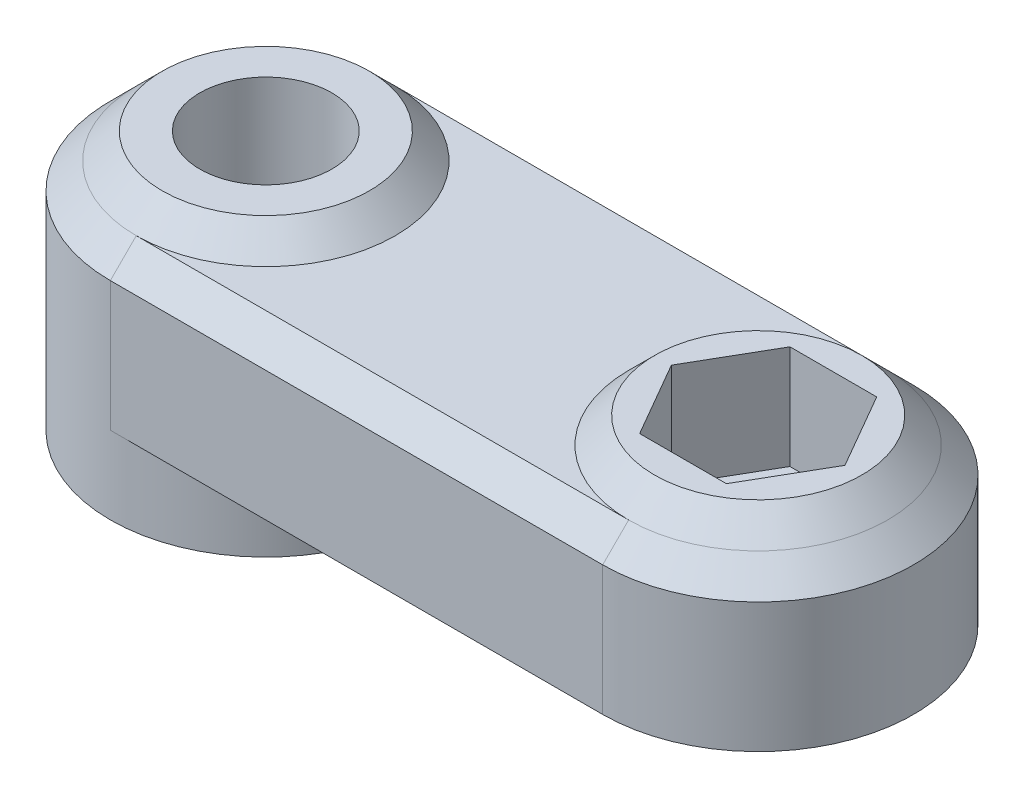
ISO-10303-21;
HEADER;
FILE_DESCRIPTION(('STEP AP214'),'2;1');
FILE_NAME('part.step','',(''),(''),'','','');
FILE_SCHEMA(('AUTOMOTIVE_DESIGN { 1 0 10303 214 1 1 1 1 }'));
ENDSEC;
DATA;
#1=APPLICATION_CONTEXT('core data for automotive mechanical design processes');
#2=APPLICATION_PROTOCOL_DEFINITION('international standard','automotive_design',2000,#1);
#3=PRODUCT_CONTEXT('',#1,'mechanical');
#4=PRODUCT('Part','Part','',(#3));
#5=PRODUCT_RELATED_PRODUCT_CATEGORY('part','',(#4));
#6=PRODUCT_DEFINITION_FORMATION('','',#4);
#7=PRODUCT_DEFINITION_CONTEXT('part definition',#1,'design');
#8=PRODUCT_DEFINITION('design','',#6,#7);
#9=PRODUCT_DEFINITION_SHAPE('','',#8);
#10=(LENGTH_UNIT() NAMED_UNIT(*) SI_UNIT(.MILLI.,.METRE.));
#11=(NAMED_UNIT(*) PLANE_ANGLE_UNIT() SI_UNIT($,.RADIAN.));
#12=(NAMED_UNIT(*) SI_UNIT($,.STERADIAN.) SOLID_ANGLE_UNIT());
#13=UNCERTAINTY_MEASURE_WITH_UNIT(LENGTH_MEASURE(1.E-05),#10,'distance_accuracy_value','');
#14=(GEOMETRIC_REPRESENTATION_CONTEXT(3) GLOBAL_UNCERTAINTY_ASSIGNED_CONTEXT((#13)) GLOBAL_UNIT_ASSIGNED_CONTEXT((#10,
#11,#12)) REPRESENTATION_CONTEXT('',''));
#15=CARTESIAN_POINT('',(0.,0.,0.));
#16=DIRECTION('',(0.,0.,1.));
#17=DIRECTION('',(1.,0.,0.));
#18=AXIS2_PLACEMENT_3D('',#15,#16,#17);
#19=CARTESIAN_POINT('',(0.,10.,0.));
#20=DIRECTION('',(0.,1.,0.));
#21=DIRECTION('',(0.,0.,1.));
#22=AXIS2_PLACEMENT_3D('',#19,#20,#21);
#23=PLANE('',#22);
#24=CARTESIAN_POINT('',(0.,10.,0.));
#25=DIRECTION('',(0.,-1.,0.));
#26=DIRECTION('',(0.,0.,-1.));
#27=AXIS2_PLACEMENT_3D('',#24,#25,#26);
#28=CIRCLE('',#27,2.55);
#29=CARTESIAN_POINT('',(0.,10.,-2.55));
#30=VERTEX_POINT('',#29);
#31=EDGE_CURVE('E276',#30,#30,#28,.T.);
#32=ORIENTED_EDGE('',*,*,#31,.T.);
#33=EDGE_LOOP('',(#32));
#34=FACE_BOUND('',#33,.T.);
#35=CARTESIAN_POINT('',(0.,10.,0.));
#36=DIRECTION('',(0.,1.,0.));
#37=DIRECTION('',(0.,0.,1.));
#38=AXIS2_PLACEMENT_3D('',#35,#36,#37);
#39=CIRCLE('',#38,4.);
#40=CARTESIAN_POINT('',(0.,10.,4.));
#41=VERTEX_POINT('',#40);
#42=EDGE_CURVE('E295',#41,#41,#39,.T.);
#43=ORIENTED_EDGE('',*,*,#42,.T.);
#44=EDGE_LOOP('',(#43));
#45=FACE_BOUND('',#44,.T.);
#46=ADVANCED_FACE('F37',(#34,#45),#23,.T.);
#47=DIRECTION('',(-0.5,0.,-0.866025403784439));
#48=VECTOR('',#47,1.);
#49=CARTESIAN_POINT('',(22.3486315612998,10.,0.));
#50=LINE('',#49,#48);
#51=CARTESIAN_POINT('',(22.3486315612998,10.,0.));
#52=VERTEX_POINT('',#51);
#53=CARTESIAN_POINT('',(20.6743157806499,10.,-2.9));
#54=VERTEX_POINT('',#53);
#55=EDGE_CURVE('E59',#52,#54,#50,.T.);
#56=ORIENTED_EDGE('',*,*,#55,.F.);
#57=DIRECTION('',(0.5,0.,-0.866025403784438));
#58=VECTOR('',#57,1.);
#59=CARTESIAN_POINT('',(20.6743157806499,10.,2.90000000000001));
#60=LINE('',#59,#58);
#61=CARTESIAN_POINT('',(20.6743157806499,10.,2.90000000000001));
#62=VERTEX_POINT('',#61);
#63=EDGE_CURVE('E325',#62,#52,#60,.T.);
#64=ORIENTED_EDGE('',*,*,#63,.F.);
#65=DIRECTION('',(1.,0.,0.));
#66=VECTOR('',#65,1.);
#67=CARTESIAN_POINT('',(17.3256842193501,10.,2.90000000000001));
#68=LINE('',#67,#66);
#69=CARTESIAN_POINT('',(17.3256842193501,10.,2.90000000000001));
#70=VERTEX_POINT('',#69);
#71=EDGE_CURVE('E348',#70,#62,#68,.T.);
#72=ORIENTED_EDGE('',*,*,#71,.F.);
#73=DIRECTION('',(0.5,0.,0.866025403784438));
#74=VECTOR('',#73,1.);
#75=CARTESIAN_POINT('',(15.6513684387002,10.,0.));
#76=LINE('',#75,#74);
#77=CARTESIAN_POINT('',(15.6513684387002,10.,0.));
#78=VERTEX_POINT('',#77);
#79=EDGE_CURVE('E345',#78,#70,#76,.T.);
#80=ORIENTED_EDGE('',*,*,#79,.F.);
#81=DIRECTION('',(-0.500000000000001,0.,0.866025403784438));
#82=VECTOR('',#81,1.);
#83=CARTESIAN_POINT('',(17.3256842193501,10.,-2.9));
#84=LINE('',#83,#82);
#85=CARTESIAN_POINT('',(17.3256842193501,10.,-2.9));
#86=VERTEX_POINT('',#85);
#87=EDGE_CURVE('E342',#86,#78,#84,.T.);
#88=ORIENTED_EDGE('',*,*,#87,.F.);
#89=DIRECTION('',(-1.,0.,0.));
#90=VECTOR('',#89,1.);
#91=CARTESIAN_POINT('',(20.6743157806499,10.,-2.9));
#92=LINE('',#91,#90);
#93=EDGE_CURVE('E317',#54,#86,#92,.T.);
#94=ORIENTED_EDGE('',*,*,#93,.F.);
#95=EDGE_LOOP('',(#56,#64,#72,#80,#88,#94));
#96=FACE_BOUND('',#95,.T.);
#97=CARTESIAN_POINT('',(19.,10.,0.));
#98=DIRECTION('',(0.,1.,0.));
#99=DIRECTION('',(0.,0.,1.));
#100=AXIS2_PLACEMENT_3D('',#97,#98,#99);
#101=CIRCLE('',#100,3.99999999999999);
#102=CARTESIAN_POINT('',(19.,10.,3.99999999999999));
#103=VERTEX_POINT('',#102);
#104=EDGE_CURVE('E292',#103,#103,#101,.T.);
#105=ORIENTED_EDGE('',*,*,#104,.T.);
#106=EDGE_LOOP('',(#105));
#107=FACE_BOUND('',#106,.T.);
#108=ADVANCED_FACE('F367',(#96,#107),#23,.T.);
#109=CARTESIAN_POINT('',(0.,10.,4.));
#110=DIRECTION('',(0.,0.707106781186546,0.707106781186549));
#111=DIRECTION('',(-1.,0.,0.));
#112=AXIS2_PLACEMENT_3D('',#109,#110,#111);
#113=PLANE('',#112);
#114=DIRECTION('',(0.,-0.707106781186549,0.707106781186546));
#115=VECTOR('',#114,1.);
#116=CARTESIAN_POINT('',(19.,10.,3.99999999999999));
#117=LINE('',#116,#115);
#118=CARTESIAN_POINT('',(19.,9.,4.99999999999999));
#119=VERTEX_POINT('',#118);
#120=CARTESIAN_POINT('',(19.,7.99999999999999,6.));
#121=VERTEX_POINT('',#120);
#122=EDGE_CURVE('E200',#119,#121,#117,.T.);
#123=ORIENTED_EDGE('',*,*,#122,.F.);
#124=DIRECTION('',(-1.,0.,0.));
#125=VECTOR('',#124,1.);
#126=CARTESIAN_POINT('',(0.,9.,4.99999999999999));
#127=LINE('',#126,#125);
#128=CARTESIAN_POINT('',(0.,9.,4.99999999999999));
#129=VERTEX_POINT('',#128);
#130=EDGE_CURVE('E315',#119,#129,#127,.T.);
#131=ORIENTED_EDGE('',*,*,#130,.T.);
#132=DIRECTION('',(0.,0.707106781186549,-0.707106781186546));
#133=VECTOR('',#132,1.);
#134=CARTESIAN_POINT('',(0.,7.99999999999999,6.));
#135=LINE('',#134,#133);
#136=CARTESIAN_POINT('',(0.,7.99999999999999,6.));
#137=VERTEX_POINT('',#136);
#138=EDGE_CURVE('E183',#137,#129,#135,.T.);
#139=ORIENTED_EDGE('',*,*,#138,.F.);
#140=DIRECTION('',(-1.,0.,0.));
#141=VECTOR('',#140,1.);
#142=CARTESIAN_POINT('',(0.,7.99999999999999,6.));
#143=LINE('',#142,#141);
#144=EDGE_CURVE('E174',#121,#137,#143,.T.);
#145=ORIENTED_EDGE('',*,*,#144,.F.);
#146=EDGE_LOOP('',(#123,#131,#139,#145));
#147=FACE_BOUND('',#146,.T.);
#148=ADVANCED_FACE('F314',(#147),#113,.T.);
#149=CARTESIAN_POINT('',(19.,10.,0.));
#150=DIRECTION('',(0.,-1.,0.));
#151=DIRECTION('',(0.,0.,-1.));
#152=AXIS2_PLACEMENT_3D('',#149,#150,#151);
#153=CONICAL_SURFACE('',#152,3.99999999999999,0.785398163397447);
#154=DIRECTION('',(0.,-0.707106781186549,-0.707106781186546));
#155=VECTOR('',#154,1.);
#156=CARTESIAN_POINT('',(19.,10.,-3.99999999999999));
#157=LINE('',#156,#155);
#158=CARTESIAN_POINT('',(19.,9.,-4.99999999999999));
#159=VERTEX_POINT('',#158);
#160=CARTESIAN_POINT('',(19.,7.99999999999999,-6.));
#161=VERTEX_POINT('',#160);
#162=EDGE_CURVE('E189',#159,#161,#157,.T.);
#163=ORIENTED_EDGE('',*,*,#162,.F.);
#164=CARTESIAN_POINT('',(19.,9.,0.));
#165=DIRECTION('',(0.,1.,0.));
#166=DIRECTION('',(0.,0.,1.));
#167=AXIS2_PLACEMENT_3D('',#164,#165,#166);
#168=CIRCLE('',#167,4.99999999999999);
#169=EDGE_CURVE('E52',#159,#119,#168,.F.);
#170=ORIENTED_EDGE('',*,*,#169,.T.);
#171=ORIENTED_EDGE('',*,*,#122,.T.);
#172=CARTESIAN_POINT('',(19.,7.99999999999999,0.));
#173=DIRECTION('',(0.,1.,0.));
#174=DIRECTION('',(0.,0.,1.));
#175=AXIS2_PLACEMENT_3D('',#172,#173,#174);
#176=CIRCLE('',#175,6.);
#177=EDGE_CURVE('E300',#161,#121,#176,.F.);
#178=ORIENTED_EDGE('',*,*,#177,.F.);
#179=EDGE_LOOP('',(#163,#170,#171,#178));
#180=FACE_BOUND('',#179,.T.);
#181=ADVANCED_FACE('F434',(#180),#153,.T.);
#182=CARTESIAN_POINT('',(0.,10.,0.));
#183=DIRECTION('',(0.,-1.,0.));
#184=DIRECTION('',(0.,0.,-1.));
#185=AXIS2_PLACEMENT_3D('',#182,#183,#184);
#186=CONICAL_SURFACE('',#185,4.,0.785398163397447);
#187=ORIENTED_EDGE('',*,*,#138,.T.);
#188=CARTESIAN_POINT('',(0.,9.,0.));
#189=DIRECTION('',(0.,1.,0.));
#190=DIRECTION('',(0.,0.,1.));
#191=AXIS2_PLACEMENT_3D('',#188,#189,#190);
#192=CIRCLE('',#191,4.99999999999999);
#193=CARTESIAN_POINT('',(0.,9.,-4.99999999999999));
#194=VERTEX_POINT('',#193);
#195=EDGE_CURVE('E165',#129,#194,#192,.F.);
#196=ORIENTED_EDGE('',*,*,#195,.T.);
#197=DIRECTION('',(0.,0.707106781186549,0.707106781186546));
#198=VECTOR('',#197,1.);
#199=CARTESIAN_POINT('',(0.,7.99999999999999,-6.));
#200=LINE('',#199,#198);
#201=CARTESIAN_POINT('',(0.,7.99999999999999,-6.));
#202=VERTEX_POINT('',#201);
#203=EDGE_CURVE('E181',#202,#194,#200,.T.);
#204=ORIENTED_EDGE('',*,*,#203,.F.);
#205=CARTESIAN_POINT('',(0.,7.99999999999999,0.));
#206=DIRECTION('',(0.,1.,0.));
#207=DIRECTION('',(0.,0.,1.));
#208=AXIS2_PLACEMENT_3D('',#205,#206,#207);
#209=CIRCLE('',#208,6.);
#210=EDGE_CURVE('E299',#137,#202,#209,.F.);
#211=ORIENTED_EDGE('',*,*,#210,.F.);
#212=EDGE_LOOP('',(#187,#196,#204,#211));
#213=FACE_BOUND('',#212,.T.);
#214=ADVANCED_FACE('F179',(#213),#186,.T.);
#215=CARTESIAN_POINT('',(0.,10.,-4.));
#216=DIRECTION('',(0.,0.707106781186546,-0.707106781186549));
#217=DIRECTION('',(1.,0.,0.));
#218=AXIS2_PLACEMENT_3D('',#215,#216,#217);
#219=PLANE('',#218);
#220=ORIENTED_EDGE('',*,*,#203,.T.);
#221=DIRECTION('',(1.,0.,0.));
#222=VECTOR('',#221,1.);
#223=CARTESIAN_POINT('',(0.,9.,-4.99999999999999));
#224=LINE('',#223,#222);
#225=EDGE_CURVE('E168',#194,#159,#224,.T.);
#226=ORIENTED_EDGE('',*,*,#225,.T.);
#227=ORIENTED_EDGE('',*,*,#162,.T.);
#228=DIRECTION('',(1.,0.,0.));
#229=VECTOR('',#228,1.);
#230=CARTESIAN_POINT('',(19.,7.99999999999999,-6.));
#231=LINE('',#230,#229);
#232=EDGE_CURVE('E188',#202,#161,#231,.T.);
#233=ORIENTED_EDGE('',*,*,#232,.F.);
#234=EDGE_LOOP('',(#220,#226,#227,#233));
#235=FACE_BOUND('',#234,.T.);
#236=ADVANCED_FACE('F186',(#235),#219,.T.);
#237=CARTESIAN_POINT('',(0.,10.,6.));
#238=DIRECTION('',(0.,0.,-1.));
#239=DIRECTION('',(-1.,0.,0.));
#240=AXIS2_PLACEMENT_3D('',#237,#238,#239);
#241=PLANE('',#240);
#242=DIRECTION('',(-1.,0.,0.));
#243=VECTOR('',#242,1.);
#244=CARTESIAN_POINT('',(0.,3.,6.));
#245=LINE('',#244,#243);
#246=CARTESIAN_POINT('',(19.,3.,6.));
#247=VERTEX_POINT('',#246);
#248=CARTESIAN_POINT('',(0.,3.,6.));
#249=VERTEX_POINT('',#248);
#250=EDGE_CURVE('E225',#247,#249,#245,.T.);
#251=ORIENTED_EDGE('',*,*,#250,.F.);
#252=DIRECTION('',(0.,-1.,0.));
#253=VECTOR('',#252,1.);
#254=CARTESIAN_POINT('',(19.,10.,6.));
#255=LINE('',#254,#253);
#256=EDGE_CURVE('E287',#121,#247,#255,.T.);
#257=ORIENTED_EDGE('',*,*,#256,.F.);
#258=ORIENTED_EDGE('',*,*,#144,.T.);
#259=DIRECTION('',(0.,-1.,0.));
#260=VECTOR('',#259,1.);
#261=CARTESIAN_POINT('',(0.,10.,6.));
#262=LINE('',#261,#260);
#263=EDGE_CURVE('E290',#137,#249,#262,.T.);
#264=ORIENTED_EDGE('',*,*,#263,.T.);
#265=EDGE_LOOP('',(#251,#257,#258,#264));
#266=FACE_BOUND('',#265,.T.);
#267=ADVANCED_FACE('F309',(#266),#241,.F.);
#268=CARTESIAN_POINT('',(19.,10.,0.));
#269=DIRECTION('',(0.,-1.,0.));
#270=DIRECTION('',(0.,0.,-1.));
#271=AXIS2_PLACEMENT_3D('',#268,#269,#270);
#272=CYLINDRICAL_SURFACE('',#271,6.);
#273=CARTESIAN_POINT('',(19.,3.,0.));
#274=DIRECTION('',(0.,-1.,0.));
#275=DIRECTION('',(0.,0.,-1.));
#276=AXIS2_PLACEMENT_3D('',#273,#274,#275);
#277=CIRCLE('',#276,6.);
#278=CARTESIAN_POINT('',(19.,3.,-6.));
#279=VERTEX_POINT('',#278);
#280=EDGE_CURVE('E209',#279,#247,#277,.T.);
#281=ORIENTED_EDGE('',*,*,#280,.F.);
#282=DIRECTION('',(0.,-1.,0.));
#283=VECTOR('',#282,1.);
#284=CARTESIAN_POINT('',(19.,10.,-6.));
#285=LINE('',#284,#283);
#286=EDGE_CURVE('E284',#161,#279,#285,.T.);
#287=ORIENTED_EDGE('',*,*,#286,.F.);
#288=ORIENTED_EDGE('',*,*,#177,.T.);
#289=ORIENTED_EDGE('',*,*,#256,.T.);
#290=EDGE_LOOP('',(#281,#287,#288,#289));
#291=FACE_BOUND('',#290,.T.);
#292=ADVANCED_FACE('F413',(#291),#272,.T.);
#293=CARTESIAN_POINT('',(0.,10.,-6.));
#294=DIRECTION('',(0.,0.,1.));
#295=DIRECTION('',(1.,0.,0.));
#296=AXIS2_PLACEMENT_3D('',#293,#294,#295);
#297=PLANE('',#296);
#298=DIRECTION('',(1.,0.,0.));
#299=VECTOR('',#298,1.);
#300=CARTESIAN_POINT('',(0.,3.,-6.));
#301=LINE('',#300,#299);
#302=CARTESIAN_POINT('',(0.,3.,-6.));
#303=VERTEX_POINT('',#302);
#304=EDGE_CURVE('E205',#303,#279,#301,.T.);
#305=ORIENTED_EDGE('',*,*,#304,.F.);
#306=DIRECTION('',(0.,-1.,0.));
#307=VECTOR('',#306,1.);
#308=CARTESIAN_POINT('',(0.,10.,-6.));
#309=LINE('',#308,#307);
#310=EDGE_CURVE('E282',#202,#303,#309,.T.);
#311=ORIENTED_EDGE('',*,*,#310,.F.);
#312=ORIENTED_EDGE('',*,*,#232,.T.);
#313=ORIENTED_EDGE('',*,*,#286,.T.);
#314=EDGE_LOOP('',(#305,#311,#312,#313));
#315=FACE_BOUND('',#314,.T.);
#316=ADVANCED_FACE('F409',(#315),#297,.F.);
#317=CARTESIAN_POINT('',(0.,0.,0.));
#318=DIRECTION('',(0.,1.,0.));
#319=DIRECTION('',(0.,0.,1.));
#320=AXIS2_PLACEMENT_3D('',#317,#318,#319);
#321=PLANE('',#320);
#322=DIRECTION('',(-1.,0.,0.));
#323=VECTOR('',#322,1.);
#324=CARTESIAN_POINT('',(2.10732848254213,0.,3.65));
#325=LINE('',#324,#323);
#326=CARTESIAN_POINT('',(2.10732848254213,0.,3.65));
#327=VERTEX_POINT('',#326);
#328=CARTESIAN_POINT('',(-2.10732848254214,0.,3.65));
#329=VERTEX_POINT('',#328);
#330=EDGE_CURVE('E249',#327,#329,#325,.T.);
#331=ORIENTED_EDGE('',*,*,#330,.F.);
#332=DIRECTION('',(-0.5,0.,0.866025403784438));
#333=VECTOR('',#332,1.);
#334=CARTESIAN_POINT('',(4.21465696508427,0.,0.));
#335=LINE('',#334,#333);
#336=CARTESIAN_POINT('',(4.21465696508427,0.,0.));
#337=VERTEX_POINT('',#336);
#338=EDGE_CURVE('E227',#337,#327,#335,.T.);
#339=ORIENTED_EDGE('',*,*,#338,.F.);
#340=DIRECTION('',(0.5,0.,0.866025403784438));
#341=VECTOR('',#340,1.);
#342=CARTESIAN_POINT('',(2.10732848254213,0.,-3.65));
#343=LINE('',#342,#341);
#344=CARTESIAN_POINT('',(2.10732848254213,0.,-3.65));
#345=VERTEX_POINT('',#344);
#346=EDGE_CURVE('E232',#345,#337,#343,.T.);
#347=ORIENTED_EDGE('',*,*,#346,.F.);
#348=DIRECTION('',(1.,0.,0.));
#349=VECTOR('',#348,1.);
#350=CARTESIAN_POINT('',(-2.10732848254213,0.,-3.65));
#351=LINE('',#350,#349);
#352=CARTESIAN_POINT('',(-2.10732848254213,0.,-3.65));
#353=VERTEX_POINT('',#352);
#354=EDGE_CURVE('E258',#353,#345,#351,.T.);
#355=ORIENTED_EDGE('',*,*,#354,.F.);
#356=DIRECTION('',(0.5,0.,-0.866025403784439));
#357=VECTOR('',#356,1.);
#358=CARTESIAN_POINT('',(-4.21465696508427,0.,0.));
#359=LINE('',#358,#357);
#360=CARTESIAN_POINT('',(-4.21465696508427,0.,0.));
#361=VERTEX_POINT('',#360);
#362=EDGE_CURVE('E255',#361,#353,#359,.T.);
#363=ORIENTED_EDGE('',*,*,#362,.F.);
#364=DIRECTION('',(-0.5,0.,-0.866025403784439));
#365=VECTOR('',#364,1.);
#366=CARTESIAN_POINT('',(-2.10732848254214,0.,3.65));
#367=LINE('',#366,#365);
#368=EDGE_CURVE('E252',#329,#361,#367,.T.);
#369=ORIENTED_EDGE('',*,*,#368,.F.);
#370=EDGE_LOOP('',(#331,#339,#347,#355,#363,#369));
#371=FACE_BOUND('',#370,.T.);
#372=CARTESIAN_POINT('',(0.,0.,0.));
#373=DIRECTION('',(0.,1.,0.));
#374=DIRECTION('',(0.,0.,1.));
#375=AXIS2_PLACEMENT_3D('',#372,#373,#374);
#376=CIRCLE('',#375,6.);
#377=CARTESIAN_POINT('',(0.,0.,6.));
#378=VERTEX_POINT('',#377);
#379=EDGE_CURVE('E279',#378,#378,#376,.T.);
#380=ORIENTED_EDGE('',*,*,#379,.F.);
#381=EDGE_LOOP('',(#380));
#382=FACE_BOUND('',#381,.T.);
#383=ADVANCED_FACE('F405',(#371,#382),#321,.F.);
#384=CARTESIAN_POINT('',(19.,0.,0.));
#385=DIRECTION('',(0.,-1.,0.));
#386=DIRECTION('',(0.,0.,-1.));
#387=AXIS2_PLACEMENT_3D('',#384,#385,#386);
#388=CYLINDRICAL_SURFACE('',#387,2.075);
#389=CARTESIAN_POINT('',(19.,6.,0.));
#390=DIRECTION('',(0.,-1.,0.));
#391=DIRECTION('',(0.,0.,-1.));
#392=AXIS2_PLACEMENT_3D('',#389,#390,#391);
#393=CIRCLE('',#392,2.075);
#394=CARTESIAN_POINT('',(19.,6.,-2.075));
#395=VERTEX_POINT('',#394);
#396=EDGE_CURVE('E202',#395,#395,#393,.T.);
#397=ORIENTED_EDGE('',*,*,#396,.F.);
#398=EDGE_LOOP('',(#397));
#399=FACE_BOUND('',#398,.T.);
#400=CARTESIAN_POINT('',(19.,3.,0.));
#401=DIRECTION('',(0.,-1.,0.));
#402=DIRECTION('',(0.,0.,-1.));
#403=AXIS2_PLACEMENT_3D('',#400,#401,#402);
#404=CIRCLE('',#403,2.075);
#405=CARTESIAN_POINT('',(19.,3.,-2.075));
#406=VERTEX_POINT('',#405);
#407=EDGE_CURVE('E203',#406,#406,#404,.T.);
#408=ORIENTED_EDGE('',*,*,#407,.T.);
#409=EDGE_LOOP('',(#408));
#410=FACE_BOUND('',#409,.T.);
#411=ADVANCED_FACE('F408',(#399,#410),#388,.F.);
#412=CARTESIAN_POINT('',(0.,10.,0.));
#413=DIRECTION('',(0.,-1.,0.));
#414=DIRECTION('',(0.,0.,-1.));
#415=AXIS2_PLACEMENT_3D('',#412,#413,#414);
#416=CYLINDRICAL_SURFACE('',#415,6.);
#417=ORIENTED_EDGE('',*,*,#379,.T.);
#418=EDGE_LOOP('',(#417));
#419=FACE_BOUND('',#418,.T.);
#420=CARTESIAN_POINT('',(0.,3.,0.));
#421=DIRECTION('',(0.,-1.,0.));
#422=DIRECTION('',(0.,0.,-1.));
#423=AXIS2_PLACEMENT_3D('',#420,#421,#422);
#424=CIRCLE('',#423,6.);
#425=EDGE_CURVE('E206',#303,#249,#424,.T.);
#426=ORIENTED_EDGE('',*,*,#425,.T.);
#427=ORIENTED_EDGE('',*,*,#263,.F.);
#428=ORIENTED_EDGE('',*,*,#210,.T.);
#429=ORIENTED_EDGE('',*,*,#310,.T.);
#430=EDGE_LOOP('',(#426,#427,#428,#429));
#431=FACE_BOUND('',#430,.T.);
#432=ADVANCED_FACE('F312',(#419,#431),#416,.T.);
#433=CARTESIAN_POINT('',(0.,-1.42756695835224,0.));
#434=DIRECTION('',(0.,-1.,0.));
#435=DIRECTION('',(0.,0.,-1.));
#436=AXIS2_PLACEMENT_3D('',#433,#434,#435);
#437=CYLINDRICAL_SURFACE('',#436,2.55);
#438=CARTESIAN_POINT('',(0.,5.,0.));
#439=DIRECTION('',(0.,-1.,0.));
#440=DIRECTION('',(0.,0.,-1.));
#441=AXIS2_PLACEMENT_3D('',#438,#439,#440);
#442=CIRCLE('',#441,2.55);
#443=CARTESIAN_POINT('',(0.,5.,-2.55));
#444=VERTEX_POINT('',#443);
#445=EDGE_CURVE('E190',#444,#444,#442,.T.);
#446=ORIENTED_EDGE('',*,*,#445,.T.);
#447=EDGE_LOOP('',(#446));
#448=FACE_BOUND('',#447,.T.);
#449=ORIENTED_EDGE('',*,*,#31,.F.);
#450=EDGE_LOOP('',(#449));
#451=FACE_BOUND('',#450,.T.);
#452=ADVANCED_FACE('F403',(#448,#451),#437,.F.);
#453=CARTESIAN_POINT('',(16.925,6.,0.));
#454=DIRECTION('',(0.,1.,0.));
#455=DIRECTION('',(0.,0.,1.));
#456=AXIS2_PLACEMENT_3D('',#453,#454,#455);
#457=PLANE('',#456);
#458=ORIENTED_EDGE('',*,*,#396,.T.);
#459=EDGE_LOOP('',(#458));
#460=FACE_BOUND('',#459,.T.);
#461=DIRECTION('',(-0.5,0.,-0.866025403784439));
#462=VECTOR('',#461,1.);
#463=CARTESIAN_POINT('',(22.3486315612998,6.,0.));
#464=LINE('',#463,#462);
#465=CARTESIAN_POINT('',(22.3486315612998,6.,0.));
#466=VERTEX_POINT('',#465);
#467=CARTESIAN_POINT('',(20.6743157806499,6.,-2.9));
#468=VERTEX_POINT('',#467);
#469=EDGE_CURVE('E321',#466,#468,#464,.T.);
#470=ORIENTED_EDGE('',*,*,#469,.T.);
#471=DIRECTION('',(-1.,0.,0.));
#472=VECTOR('',#471,1.);
#473=CARTESIAN_POINT('',(20.6743157806499,6.,-2.9));
#474=LINE('',#473,#472);
#475=CARTESIAN_POINT('',(17.3256842193501,6.,-2.9));
#476=VERTEX_POINT('',#475);
#477=EDGE_CURVE('E324',#468,#476,#474,.T.);
#478=ORIENTED_EDGE('',*,*,#477,.T.);
#479=DIRECTION('',(-0.500000000000001,0.,0.866025403784438));
#480=VECTOR('',#479,1.);
#481=CARTESIAN_POINT('',(17.3256842193501,6.,-2.9));
#482=LINE('',#481,#480);
#483=CARTESIAN_POINT('',(15.6513684387002,6.,0.));
#484=VERTEX_POINT('',#483);
#485=EDGE_CURVE('E328',#476,#484,#482,.T.);
#486=ORIENTED_EDGE('',*,*,#485,.T.);
#487=DIRECTION('',(0.5,0.,0.866025403784438));
#488=VECTOR('',#487,1.);
#489=CARTESIAN_POINT('',(15.6513684387002,6.,0.));
#490=LINE('',#489,#488);
#491=CARTESIAN_POINT('',(17.3256842193501,6.,2.90000000000001));
#492=VERTEX_POINT('',#491);
#493=EDGE_CURVE('E331',#484,#492,#490,.T.);
#494=ORIENTED_EDGE('',*,*,#493,.T.);
#495=DIRECTION('',(1.,0.,0.));
#496=VECTOR('',#495,1.);
#497=CARTESIAN_POINT('',(17.3256842193501,6.,2.90000000000001));
#498=LINE('',#497,#496);
#499=CARTESIAN_POINT('',(20.6743157806499,6.,2.90000000000001));
#500=VERTEX_POINT('',#499);
#501=EDGE_CURVE('E334',#492,#500,#498,.T.);
#502=ORIENTED_EDGE('',*,*,#501,.T.);
#503=DIRECTION('',(0.5,0.,-0.866025403784438));
#504=VECTOR('',#503,1.);
#505=CARTESIAN_POINT('',(20.6743157806499,6.,2.90000000000001));
#506=LINE('',#505,#504);
#507=EDGE_CURVE('E337',#500,#466,#506,.T.);
#508=ORIENTED_EDGE('',*,*,#507,.T.);
#509=EDGE_LOOP('',(#470,#478,#486,#494,#502,#508));
#510=FACE_BOUND('',#509,.T.);
#511=ADVANCED_FACE('F378',(#460,#510),#457,.T.);
#512=CARTESIAN_POINT('',(4.21465696508427,5.,0.));
#513=DIRECTION('',(0.866025403784438,0.,0.5));
#514=DIRECTION('',(0.5,0.,-0.866025403784439));
#515=AXIS2_PLACEMENT_3D('',#512,#513,#514);
#516=PLANE('',#515);
#517=ORIENTED_EDGE('',*,*,#338,.T.);
#518=DIRECTION('',(0.,-1.,0.));
#519=VECTOR('',#518,1.);
#520=CARTESIAN_POINT('',(2.10732848254213,5.,3.65));
#521=LINE('',#520,#519);
#522=CARTESIAN_POINT('',(2.10732848254213,5.,3.65));
#523=VERTEX_POINT('',#522);
#524=EDGE_CURVE('E247',#523,#327,#521,.T.);
#525=ORIENTED_EDGE('',*,*,#524,.F.);
#526=DIRECTION('',(-0.5,0.,0.866025403784438));
#527=VECTOR('',#526,1.);
#528=CARTESIAN_POINT('',(4.21465696508427,5.,0.));
#529=LINE('',#528,#527);
#530=CARTESIAN_POINT('',(4.21465696508427,5.,0.));
#531=VERTEX_POINT('',#530);
#532=EDGE_CURVE('E228',#531,#523,#529,.T.);
#533=ORIENTED_EDGE('',*,*,#532,.F.);
#534=DIRECTION('',(0.,-1.,0.));
#535=VECTOR('',#534,1.);
#536=CARTESIAN_POINT('',(4.21465696508427,5.,0.));
#537=LINE('',#536,#535);
#538=EDGE_CURVE('E194',#531,#337,#537,.T.);
#539=ORIENTED_EDGE('',*,*,#538,.T.);
#540=EDGE_LOOP('',(#517,#525,#533,#539));
#541=FACE_BOUND('',#540,.T.);
#542=ADVANCED_FACE('F480',(#541),#516,.F.);
#543=CARTESIAN_POINT('',(2.10732848254213,5.,-3.65));
#544=DIRECTION('',(0.866025403784439,0.,-0.5));
#545=DIRECTION('',(-0.5,0.,-0.866025403784439));
#546=AXIS2_PLACEMENT_3D('',#543,#544,#545);
#547=PLANE('',#546);
#548=ORIENTED_EDGE('',*,*,#346,.T.);
#549=ORIENTED_EDGE('',*,*,#538,.F.);
#550=DIRECTION('',(0.5,0.,0.866025403784438));
#551=VECTOR('',#550,1.);
#552=CARTESIAN_POINT('',(2.10732848254213,5.,-3.65));
#553=LINE('',#552,#551);
#554=CARTESIAN_POINT('',(2.10732848254213,5.,-3.65));
#555=VERTEX_POINT('',#554);
#556=EDGE_CURVE('E244',#555,#531,#553,.T.);
#557=ORIENTED_EDGE('',*,*,#556,.F.);
#558=DIRECTION('',(0.,-1.,0.));
#559=VECTOR('',#558,1.);
#560=CARTESIAN_POINT('',(2.10732848254213,5.,-3.65));
#561=LINE('',#560,#559);
#562=EDGE_CURVE('E264',#555,#345,#561,.T.);
#563=ORIENTED_EDGE('',*,*,#562,.T.);
#564=EDGE_LOOP('',(#548,#549,#557,#563));
#565=FACE_BOUND('',#564,.T.);
#566=ADVANCED_FACE('F476',(#565),#547,.F.);
#567=CARTESIAN_POINT('',(-2.10732848254213,5.,-3.65));
#568=DIRECTION('',(0.,0.,-1.));
#569=DIRECTION('',(-1.,0.,0.));
#570=AXIS2_PLACEMENT_3D('',#567,#568,#569);
#571=PLANE('',#570);
#572=ORIENTED_EDGE('',*,*,#354,.T.);
#573=ORIENTED_EDGE('',*,*,#562,.F.);
#574=DIRECTION('',(1.,0.,0.));
#575=VECTOR('',#574,1.);
#576=CARTESIAN_POINT('',(-2.10732848254213,5.,-3.65));
#577=LINE('',#576,#575);
#578=CARTESIAN_POINT('',(-2.10732848254213,5.,-3.65));
#579=VERTEX_POINT('',#578);
#580=EDGE_CURVE('E241',#579,#555,#577,.T.);
#581=ORIENTED_EDGE('',*,*,#580,.F.);
#582=DIRECTION('',(0.,-1.,0.));
#583=VECTOR('',#582,1.);
#584=CARTESIAN_POINT('',(-2.10732848254213,5.,-3.65));
#585=LINE('',#584,#583);
#586=EDGE_CURVE('E266',#579,#353,#585,.T.);
#587=ORIENTED_EDGE('',*,*,#586,.T.);
#588=EDGE_LOOP('',(#572,#573,#581,#587));
#589=FACE_BOUND('',#588,.T.);
#590=ADVANCED_FACE('F479',(#589),#571,.F.);
#591=CARTESIAN_POINT('',(-4.21465696508427,5.,0.));
#592=DIRECTION('',(-0.866025403784439,0.,-0.5));
#593=DIRECTION('',(-0.5,0.,0.866025403784439));
#594=AXIS2_PLACEMENT_3D('',#591,#592,#593);
#595=PLANE('',#594);
#596=ORIENTED_EDGE('',*,*,#362,.T.);
#597=ORIENTED_EDGE('',*,*,#586,.F.);
#598=DIRECTION('',(0.5,0.,-0.866025403784439));
#599=VECTOR('',#598,1.);
#600=CARTESIAN_POINT('',(-4.21465696508427,5.,0.));
#601=LINE('',#600,#599);
#602=CARTESIAN_POINT('',(-4.21465696508427,5.,0.));
#603=VERTEX_POINT('',#602);
#604=EDGE_CURVE('E238',#603,#579,#601,.T.);
#605=ORIENTED_EDGE('',*,*,#604,.F.);
#606=DIRECTION('',(0.,-1.,0.));
#607=VECTOR('',#606,1.);
#608=CARTESIAN_POINT('',(-4.21465696508427,5.,0.));
#609=LINE('',#608,#607);
#610=EDGE_CURVE('E268',#603,#361,#609,.T.);
#611=ORIENTED_EDGE('',*,*,#610,.T.);
#612=EDGE_LOOP('',(#596,#597,#605,#611));
#613=FACE_BOUND('',#612,.T.);
#614=ADVANCED_FACE('F484',(#613),#595,.F.);
#615=CARTESIAN_POINT('',(-2.10732848254214,5.,3.65));
#616=DIRECTION('',(-0.866025403784439,0.,0.5));
#617=DIRECTION('',(0.5,0.,0.866025403784439));
#618=AXIS2_PLACEMENT_3D('',#615,#616,#617);
#619=PLANE('',#618);
#620=ORIENTED_EDGE('',*,*,#368,.T.);
#621=ORIENTED_EDGE('',*,*,#610,.F.);
#622=DIRECTION('',(-0.5,0.,-0.866025403784439));
#623=VECTOR('',#622,1.);
#624=CARTESIAN_POINT('',(-2.10732848254214,5.,3.65));
#625=LINE('',#624,#623);
#626=CARTESIAN_POINT('',(-2.10732848254214,5.,3.65));
#627=VERTEX_POINT('',#626);
#628=EDGE_CURVE('E235',#627,#603,#625,.T.);
#629=ORIENTED_EDGE('',*,*,#628,.F.);
#630=DIRECTION('',(0.,-1.,0.));
#631=VECTOR('',#630,1.);
#632=CARTESIAN_POINT('',(-2.10732848254214,5.,3.65));
#633=LINE('',#632,#631);
#634=EDGE_CURVE('E270',#627,#329,#633,.T.);
#635=ORIENTED_EDGE('',*,*,#634,.T.);
#636=EDGE_LOOP('',(#620,#621,#629,#635));
#637=FACE_BOUND('',#636,.T.);
#638=ADVANCED_FACE('F488',(#637),#619,.F.);
#639=CARTESIAN_POINT('',(2.10732848254213,5.,3.65));
#640=DIRECTION('',(0.,0.,1.));
#641=DIRECTION('',(1.,0.,0.));
#642=AXIS2_PLACEMENT_3D('',#639,#640,#641);
#643=PLANE('',#642);
#644=ORIENTED_EDGE('',*,*,#330,.T.);
#645=ORIENTED_EDGE('',*,*,#634,.F.);
#646=DIRECTION('',(-1.,0.,0.));
#647=VECTOR('',#646,1.);
#648=CARTESIAN_POINT('',(2.10732848254213,5.,3.65));
#649=LINE('',#648,#647);
#650=EDGE_CURVE('E231',#523,#627,#649,.T.);
#651=ORIENTED_EDGE('',*,*,#650,.F.);
#652=ORIENTED_EDGE('',*,*,#524,.T.);
#653=EDGE_LOOP('',(#644,#645,#651,#652));
#654=FACE_BOUND('',#653,.T.);
#655=ADVANCED_FACE('F474',(#654),#643,.F.);
#656=CARTESIAN_POINT('',(0.,5.,0.));
#657=DIRECTION('',(0.,-1.,0.));
#658=DIRECTION('',(0.,0.,-1.));
#659=AXIS2_PLACEMENT_3D('',#656,#657,#658);
#660=PLANE('',#659);
#661=ORIENTED_EDGE('',*,*,#445,.F.);
#662=EDGE_LOOP('',(#661));
#663=FACE_BOUND('',#662,.T.);
#664=ORIENTED_EDGE('',*,*,#532,.T.);
#665=ORIENTED_EDGE('',*,*,#650,.T.);
#666=ORIENTED_EDGE('',*,*,#628,.T.);
#667=ORIENTED_EDGE('',*,*,#604,.T.);
#668=ORIENTED_EDGE('',*,*,#580,.T.);
#669=ORIENTED_EDGE('',*,*,#556,.T.);
#670=EDGE_LOOP('',(#664,#665,#666,#667,#668,#669));
#671=FACE_BOUND('',#670,.T.);
#672=ADVANCED_FACE('F470',(#663,#671),#660,.T.);
#673=CARTESIAN_POINT('',(0.,3.,0.));
#674=DIRECTION('',(0.,-1.,0.));
#675=DIRECTION('',(0.,0.,-1.));
#676=AXIS2_PLACEMENT_3D('',#673,#674,#675);
#677=PLANE('',#676);
#678=ORIENTED_EDGE('',*,*,#407,.F.);
#679=EDGE_LOOP('',(#678));
#680=FACE_BOUND('',#679,.T.);
#681=ORIENTED_EDGE('',*,*,#250,.T.);
#682=ORIENTED_EDGE('',*,*,#425,.F.);
#683=ORIENTED_EDGE('',*,*,#304,.T.);
#684=ORIENTED_EDGE('',*,*,#280,.T.);
#685=EDGE_LOOP('',(#681,#682,#683,#684));
#686=FACE_BOUND('',#685,.T.);
#687=ADVANCED_FACE('F467',(#680,#686),#677,.T.);
#688=CARTESIAN_POINT('',(22.3486315612998,6.,0.));
#689=DIRECTION('',(0.866025403784439,0.,-0.5));
#690=DIRECTION('',(-0.5,0.,-0.866025403784439));
#691=AXIS2_PLACEMENT_3D('',#688,#689,#690);
#692=PLANE('',#691);
#693=ORIENTED_EDGE('',*,*,#55,.T.);
#694=DIRECTION('',(0.,1.,0.));
#695=VECTOR('',#694,1.);
#696=CARTESIAN_POINT('',(20.6743157806499,6.,-2.9));
#697=LINE('',#696,#695);
#698=EDGE_CURVE('E221',#468,#54,#697,.T.);
#699=ORIENTED_EDGE('',*,*,#698,.F.);
#700=ORIENTED_EDGE('',*,*,#469,.F.);
#701=DIRECTION('',(0.,1.,0.));
#702=VECTOR('',#701,1.);
#703=CARTESIAN_POINT('',(22.3486315612998,6.,0.));
#704=LINE('',#703,#702);
#705=EDGE_CURVE('E212',#466,#52,#704,.T.);
#706=ORIENTED_EDGE('',*,*,#705,.T.);
#707=EDGE_LOOP('',(#693,#699,#700,#706));
#708=FACE_BOUND('',#707,.T.);
#709=ADVANCED_FACE('F380',(#708),#692,.F.);
#710=CARTESIAN_POINT('',(20.6743157806499,6.,2.90000000000001));
#711=DIRECTION('',(0.866025403784438,0.,0.5));
#712=DIRECTION('',(0.5,0.,-0.866025403784438));
#713=AXIS2_PLACEMENT_3D('',#710,#711,#712);
#714=PLANE('',#713);
#715=ORIENTED_EDGE('',*,*,#63,.T.);
#716=ORIENTED_EDGE('',*,*,#705,.F.);
#717=ORIENTED_EDGE('',*,*,#507,.F.);
#718=DIRECTION('',(0.,1.,0.));
#719=VECTOR('',#718,1.);
#720=CARTESIAN_POINT('',(20.6743157806499,6.,2.90000000000001));
#721=LINE('',#720,#719);
#722=EDGE_CURVE('E218',#500,#62,#721,.T.);
#723=ORIENTED_EDGE('',*,*,#722,.T.);
#724=EDGE_LOOP('',(#715,#716,#717,#723));
#725=FACE_BOUND('',#724,.T.);
#726=ADVANCED_FACE('F382',(#725),#714,.F.);
#727=CARTESIAN_POINT('',(17.3256842193501,6.,2.90000000000001));
#728=DIRECTION('',(0.,0.,1.));
#729=DIRECTION('',(1.,0.,0.));
#730=AXIS2_PLACEMENT_3D('',#727,#728,#729);
#731=PLANE('',#730);
#732=ORIENTED_EDGE('',*,*,#71,.T.);
#733=ORIENTED_EDGE('',*,*,#722,.F.);
#734=ORIENTED_EDGE('',*,*,#501,.F.);
#735=DIRECTION('',(0.,1.,0.));
#736=VECTOR('',#735,1.);
#737=CARTESIAN_POINT('',(17.3256842193501,6.,2.90000000000001));
#738=LINE('',#737,#736);
#739=EDGE_CURVE('E354',#492,#70,#738,.T.);
#740=ORIENTED_EDGE('',*,*,#739,.T.);
#741=EDGE_LOOP('',(#732,#733,#734,#740));
#742=FACE_BOUND('',#741,.T.);
#743=ADVANCED_FACE('F384',(#742),#731,.F.);
#744=CARTESIAN_POINT('',(15.6513684387002,6.,0.));
#745=DIRECTION('',(-0.866025403784439,0.,0.5));
#746=DIRECTION('',(0.5,0.,0.866025403784439));
#747=AXIS2_PLACEMENT_3D('',#744,#745,#746);
#748=PLANE('',#747);
#749=ORIENTED_EDGE('',*,*,#79,.T.);
#750=ORIENTED_EDGE('',*,*,#739,.F.);
#751=ORIENTED_EDGE('',*,*,#493,.F.);
#752=DIRECTION('',(0.,1.,0.));
#753=VECTOR('',#752,1.);
#754=CARTESIAN_POINT('',(15.6513684387002,6.,0.));
#755=LINE('',#754,#753);
#756=EDGE_CURVE('E356',#484,#78,#755,.T.);
#757=ORIENTED_EDGE('',*,*,#756,.T.);
#758=EDGE_LOOP('',(#749,#750,#751,#757));
#759=FACE_BOUND('',#758,.T.);
#760=ADVANCED_FACE('F375',(#759),#748,.F.);
#761=CARTESIAN_POINT('',(17.3256842193501,6.,-2.9));
#762=DIRECTION('',(-0.866025403784438,0.,-0.500000000000001));
#763=DIRECTION('',(-0.500000000000001,0.,0.866025403784438));
#764=AXIS2_PLACEMENT_3D('',#761,#762,#763);
#765=PLANE('',#764);
#766=ORIENTED_EDGE('',*,*,#87,.T.);
#767=ORIENTED_EDGE('',*,*,#756,.F.);
#768=ORIENTED_EDGE('',*,*,#485,.F.);
#769=DIRECTION('',(0.,1.,0.));
#770=VECTOR('',#769,1.);
#771=CARTESIAN_POINT('',(17.3256842193501,6.,-2.9));
#772=LINE('',#771,#770);
#773=EDGE_CURVE('E357',#476,#86,#772,.T.);
#774=ORIENTED_EDGE('',*,*,#773,.T.);
#775=EDGE_LOOP('',(#766,#767,#768,#774));
#776=FACE_BOUND('',#775,.T.);
#777=ADVANCED_FACE('F372',(#776),#765,.F.);
#778=CARTESIAN_POINT('',(20.6743157806499,6.,-2.9));
#779=DIRECTION('',(0.,0.,-1.));
#780=DIRECTION('',(-1.,0.,0.));
#781=AXIS2_PLACEMENT_3D('',#778,#779,#780);
#782=PLANE('',#781);
#783=ORIENTED_EDGE('',*,*,#93,.T.);
#784=ORIENTED_EDGE('',*,*,#773,.F.);
#785=ORIENTED_EDGE('',*,*,#477,.F.);
#786=ORIENTED_EDGE('',*,*,#698,.T.);
#787=EDGE_LOOP('',(#783,#784,#785,#786));
#788=FACE_BOUND('',#787,.T.);
#789=ADVANCED_FACE('F363',(#788),#782,.F.);
#790=CARTESIAN_POINT('',(0.,9.,0.));
#791=DIRECTION('',(0.,1.,0.));
#792=DIRECTION('',(0.,0.,1.));
#793=AXIS2_PLACEMENT_3D('',#790,#791,#792);
#794=PLANE('',#793);
#795=ORIENTED_EDGE('',*,*,#130,.F.);
#796=CARTESIAN_POINT('',(19.,9.,0.));
#797=DIRECTION('',(0.,1.,0.));
#798=DIRECTION('',(0.,0.,1.));
#799=AXIS2_PLACEMENT_3D('',#796,#797,#798);
#800=CIRCLE('',#799,4.99999999999999);
#801=EDGE_CURVE('E11',#119,#159,#800,.F.);
#802=ORIENTED_EDGE('',*,*,#801,.T.);
#803=ORIENTED_EDGE('',*,*,#225,.F.);
#804=CARTESIAN_POINT('',(0.,9.,0.));
#805=DIRECTION('',(0.,1.,0.));
#806=DIRECTION('',(0.,0.,1.));
#807=AXIS2_PLACEMENT_3D('',#804,#805,#806);
#808=CIRCLE('',#807,4.99999999999999);
#809=EDGE_CURVE('E46',#194,#129,#808,.F.);
#810=ORIENTED_EDGE('',*,*,#809,.T.);
#811=EDGE_LOOP('',(#795,#802,#803,#810));
#812=FACE_BOUND('',#811,.T.);
#813=ADVANCED_FACE('F170',(#812),#794,.T.);
#814=CARTESIAN_POINT('',(19.,10.,0.));
#815=DIRECTION('',(0.,-1.,0.));
#816=DIRECTION('',(0.,0.,-1.));
#817=AXIS2_PLACEMENT_3D('',#814,#815,#816);
#818=CONICAL_SURFACE('',#817,3.99999999999999,0.785398163397443);
#819=ORIENTED_EDGE('',*,*,#169,.F.);
#820=ORIENTED_EDGE('',*,*,#801,.F.);
#821=EDGE_LOOP('',(#819,#820));
#822=FACE_BOUND('',#821,.T.);
#823=ORIENTED_EDGE('',*,*,#104,.F.);
#824=EDGE_LOOP('',(#823));
#825=FACE_BOUND('',#824,.T.);
#826=ADVANCED_FACE('F444',(#822,#825),#818,.T.);
#827=CARTESIAN_POINT('',(0.,10.,0.));
#828=DIRECTION('',(0.,-1.,0.));
#829=DIRECTION('',(0.,0.,-1.));
#830=AXIS2_PLACEMENT_3D('',#827,#828,#829);
#831=CONICAL_SURFACE('',#830,3.99999999999999,0.785398163397443);
#832=ORIENTED_EDGE('',*,*,#809,.F.);
#833=ORIENTED_EDGE('',*,*,#195,.F.);
#834=EDGE_LOOP('',(#832,#833));
#835=FACE_BOUND('',#834,.T.);
#836=ORIENTED_EDGE('',*,*,#42,.F.);
#837=EDGE_LOOP('',(#836));
#838=FACE_BOUND('',#837,.T.);
#839=ADVANCED_FACE('F40',(#835,#838),#831,.T.);
#840=CLOSED_SHELL('',(#46,#108,#148,#181,#214,#236,#267,#292,#316,#383,#411,#432,#452,#511,#542,
#566,#590,#614,#638,#655,#672,#687,#709,#726,#743,#760,#777,#789,#813,#826,#839));
#841=MANIFOLD_SOLID_BREP('B2',#840);
#842=ADVANCED_BREP_SHAPE_REPRESENTATION('',(#18,#841),#14);
#843=SHAPE_DEFINITION_REPRESENTATION(#9,#842);
ENDSEC;
END-ISO-10303-21;
